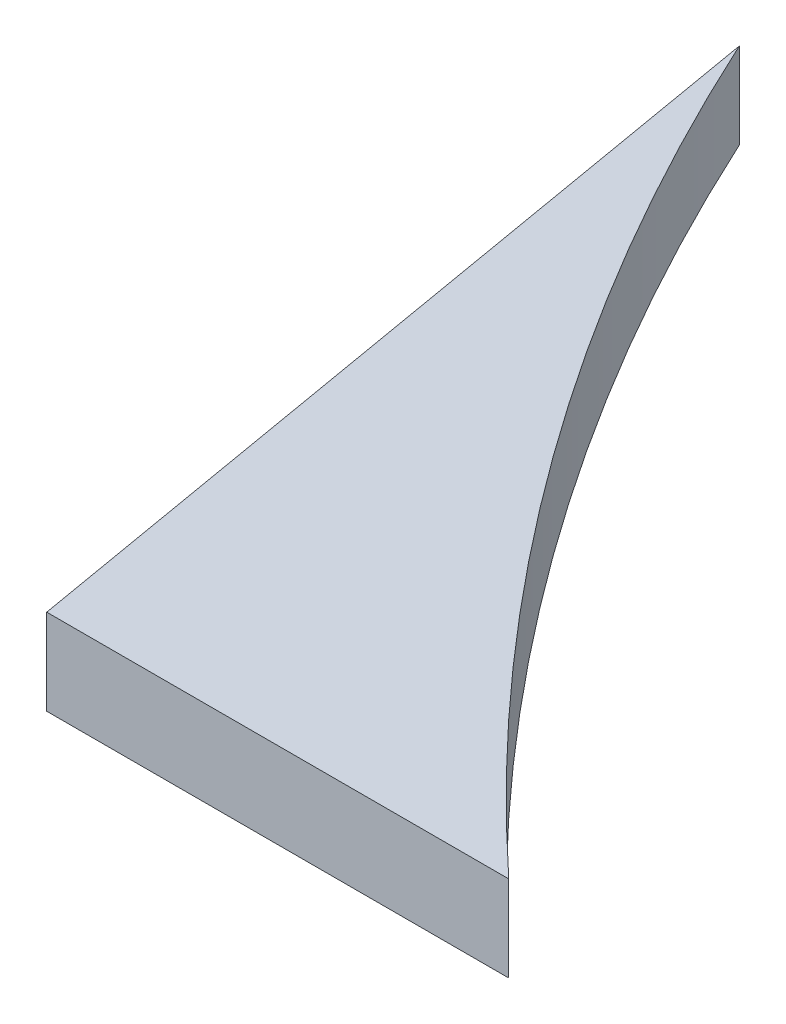
ISO-10303-21;
HEADER;
FILE_DESCRIPTION(('STEP AP214'),'2;1');
FILE_NAME('part.step','',(''),(''),'','','');
FILE_SCHEMA(('AUTOMOTIVE_DESIGN { 1 0 10303 214 1 1 1 1 }'));
ENDSEC;
DATA;
#1=APPLICATION_CONTEXT('core data for automotive mechanical design processes');
#2=APPLICATION_PROTOCOL_DEFINITION('international standard','automotive_design',2000,#1);
#3=PRODUCT_CONTEXT('',#1,'mechanical');
#4=PRODUCT('Part','Part','',(#3));
#5=PRODUCT_RELATED_PRODUCT_CATEGORY('part','',(#4));
#6=PRODUCT_DEFINITION_FORMATION('','',#4);
#7=PRODUCT_DEFINITION_CONTEXT('part definition',#1,'design');
#8=PRODUCT_DEFINITION('design','',#6,#7);
#9=PRODUCT_DEFINITION_SHAPE('','',#8);
#10=(LENGTH_UNIT() NAMED_UNIT(*) SI_UNIT(.MILLI.,.METRE.));
#11=(NAMED_UNIT(*) PLANE_ANGLE_UNIT() SI_UNIT($,.RADIAN.));
#12=(NAMED_UNIT(*) SI_UNIT($,.STERADIAN.) SOLID_ANGLE_UNIT());
#13=UNCERTAINTY_MEASURE_WITH_UNIT(LENGTH_MEASURE(1.E-05),#10,'distance_accuracy_value','');
#14=(GEOMETRIC_REPRESENTATION_CONTEXT(3) GLOBAL_UNCERTAINTY_ASSIGNED_CONTEXT((#13)) GLOBAL_UNIT_ASSIGNED_CONTEXT((#10,
#11,#12)) REPRESENTATION_CONTEXT('',''));
#15=CARTESIAN_POINT('',(0.,0.,0.));
#16=DIRECTION('',(0.,0.,1.));
#17=DIRECTION('',(1.,0.,0.));
#18=AXIS2_PLACEMENT_3D('',#15,#16,#17);
#19=CARTESIAN_POINT('',(0.,1.,59.1141022471));
#20=DIRECTION('',(0.,-1.,0.));
#21=DIRECTION('',(0.,0.,-1.));
#22=AXIS2_PLACEMENT_3D('',#19,#20,#21);
#23=CYLINDRICAL_SURFACE('',#22,31.);
#24=CARTESIAN_POINT('',(0.,0.,59.1141022471));
#25=DIRECTION('',(0.,1.,0.));
#26=DIRECTION('',(0.,0.,1.));
#27=AXIS2_PLACEMENT_3D('',#24,#25,#26);
#28=CIRCLE('',#27,31.);
#29=CARTESIAN_POINT('',(-28.157694817786,0.,72.0811459559964));
#30=VERTEX_POINT('',#29);
#31=CARTESIAN_POINT('',(-21.0970702423671,0.,81.827834375234));
#32=VERTEX_POINT('',#31);
#33=EDGE_CURVE('E75',#30,#32,#28,.T.);
#34=ORIENTED_EDGE('',*,*,#33,.F.);
#35=DIRECTION('',(0.,-1.,0.));
#36=VECTOR('',#35,1.);
#37=CARTESIAN_POINT('',(-28.157694817786,1.,72.0811459559964));
#38=LINE('',#37,#36);
#39=CARTESIAN_POINT('',(-28.157694817786,1.,72.0811459559964));
#40=VERTEX_POINT('',#39);
#41=EDGE_CURVE('E11',#40,#30,#38,.T.);
#42=ORIENTED_EDGE('',*,*,#41,.F.);
#43=CARTESIAN_POINT('',(0.,1.,59.1141022471));
#44=DIRECTION('',(0.,1.,0.));
#45=DIRECTION('',(0.,0.,1.));
#46=AXIS2_PLACEMENT_3D('',#43,#44,#45);
#47=CIRCLE('',#46,31.);
#48=CARTESIAN_POINT('',(-21.0970702423671,1.,81.827834375234));
#49=VERTEX_POINT('',#48);
#50=EDGE_CURVE('E73',#40,#49,#47,.T.);
#51=ORIENTED_EDGE('',*,*,#50,.T.);
#52=DIRECTION('',(0.,-1.,0.));
#53=VECTOR('',#52,1.);
#54=CARTESIAN_POINT('',(-21.0970702423671,1.,81.827834375234));
#55=LINE('',#54,#53);
#56=EDGE_CURVE('E57',#49,#32,#55,.T.);
#57=ORIENTED_EDGE('',*,*,#56,.T.);
#58=EDGE_LOOP('',(#34,#42,#51,#57));
#59=FACE_BOUND('',#58,.T.);
#60=ADVANCED_FACE('F41',(#59),#23,.F.);
#61=CARTESIAN_POINT('',(-39.3987026148938,1.,6.78238135082378));
#62=DIRECTION('',(-0.985504052106778,0.,0.169651888528012));
#63=DIRECTION('',(0.169651888528012,0.,0.985504052106778));
#64=AXIS2_PLACEMENT_3D('',#61,#62,#63);
#65=PLANE('',#64);
#66=DIRECTION('',(-0.169651888528012,0.,-0.985504052106778));
#67=VECTOR('',#66,1.);
#68=CARTESIAN_POINT('',(-39.3987026148938,0.,6.78238135082378));
#69=LINE('',#68,#67);
#70=CARTESIAN_POINT('',(-26.4798284572393,0.,81.827834375202));
#71=VERTEX_POINT('',#70);
#72=EDGE_CURVE('E91',#71,#30,#69,.T.);
#73=ORIENTED_EDGE('',*,*,#72,.F.);
#74=DIRECTION('',(0.,-1.,0.));
#75=VECTOR('',#74,1.);
#76=CARTESIAN_POINT('',(-26.4798284572393,1.,81.827834375202));
#77=LINE('',#76,#75);
#78=CARTESIAN_POINT('',(-26.4798284572393,1.,81.827834375202));
#79=VERTEX_POINT('',#78);
#80=EDGE_CURVE('E49',#79,#71,#77,.T.);
#81=ORIENTED_EDGE('',*,*,#80,.F.);
#82=DIRECTION('',(-0.169651888528012,0.,-0.985504052106778));
#83=VECTOR('',#82,1.);
#84=CARTESIAN_POINT('',(-39.3987026148938,1.,6.78238135082378));
#85=LINE('',#84,#83);
#86=EDGE_CURVE('E82',#79,#40,#85,.T.);
#87=ORIENTED_EDGE('',*,*,#86,.T.);
#88=ORIENTED_EDGE('',*,*,#41,.T.);
#89=EDGE_LOOP('',(#73,#81,#87,#88));
#90=FACE_BOUND('',#89,.T.);
#91=ADVANCED_FACE('F86',(#90),#65,.T.);
#92=CARTESIAN_POINT('',(-4.86281063213614E-10,1.,81.8278343753594));
#93=DIRECTION('',(-5.94273411884461E-12,0.,1.));
#94=DIRECTION('',(1.,0.,5.94273411884461E-12));
#95=AXIS2_PLACEMENT_3D('',#92,#93,#94);
#96=PLANE('',#95);
#97=DIRECTION('',(-1.,0.,-5.94273411884461E-12));
#98=VECTOR('',#97,1.);
#99=CARTESIAN_POINT('',(-4.86281063213614E-10,0.,81.8278343753594));
#100=LINE('',#99,#98);
#101=EDGE_CURVE('E84',#32,#71,#100,.T.);
#102=ORIENTED_EDGE('',*,*,#101,.F.);
#103=ORIENTED_EDGE('',*,*,#56,.F.);
#104=DIRECTION('',(-1.,0.,-5.94273411884461E-12));
#105=VECTOR('',#104,1.);
#106=CARTESIAN_POINT('',(-4.86281063213614E-10,1.,81.8278343753594));
#107=LINE('',#106,#105);
#108=EDGE_CURVE('E83',#49,#79,#107,.T.);
#109=ORIENTED_EDGE('',*,*,#108,.T.);
#110=ORIENTED_EDGE('',*,*,#80,.T.);
#111=EDGE_LOOP('',(#102,#103,#109,#110));
#112=FACE_BOUND('',#111,.T.);
#113=ADVANCED_FACE('F97',(#112),#96,.T.);
#114=CARTESIAN_POINT('',(0.,1.,0.));
#115=DIRECTION('',(0.,1.,0.));
#116=DIRECTION('',(0.,0.,1.));
#117=AXIS2_PLACEMENT_3D('',#114,#115,#116);
#118=PLANE('',#117);
#119=ORIENTED_EDGE('',*,*,#50,.F.);
#120=ORIENTED_EDGE('',*,*,#86,.F.);
#121=ORIENTED_EDGE('',*,*,#108,.F.);
#122=EDGE_LOOP('',(#119,#120,#121));
#123=FACE_BOUND('',#122,.T.);
#124=ADVANCED_FACE('F81',(#123),#118,.T.);
#125=CARTESIAN_POINT('',(0.,0.,0.));
#126=DIRECTION('',(0.,1.,0.));
#127=DIRECTION('',(0.,0.,1.));
#128=AXIS2_PLACEMENT_3D('',#125,#126,#127);
#129=PLANE('',#128);
#130=ORIENTED_EDGE('',*,*,#33,.T.);
#131=ORIENTED_EDGE('',*,*,#101,.T.);
#132=ORIENTED_EDGE('',*,*,#72,.T.);
#133=EDGE_LOOP('',(#130,#131,#132));
#134=FACE_BOUND('',#133,.T.);
#135=ADVANCED_FACE('F96',(#134),#129,.F.);
#136=CLOSED_SHELL('',(#60,#91,#113,#124,#135));
#137=MANIFOLD_SOLID_BREP('B2',#136);
#138=ADVANCED_BREP_SHAPE_REPRESENTATION('',(#18,#137),#14);
#139=SHAPE_DEFINITION_REPRESENTATION(#9,#138);
ENDSEC;
END-ISO-10303-21;
